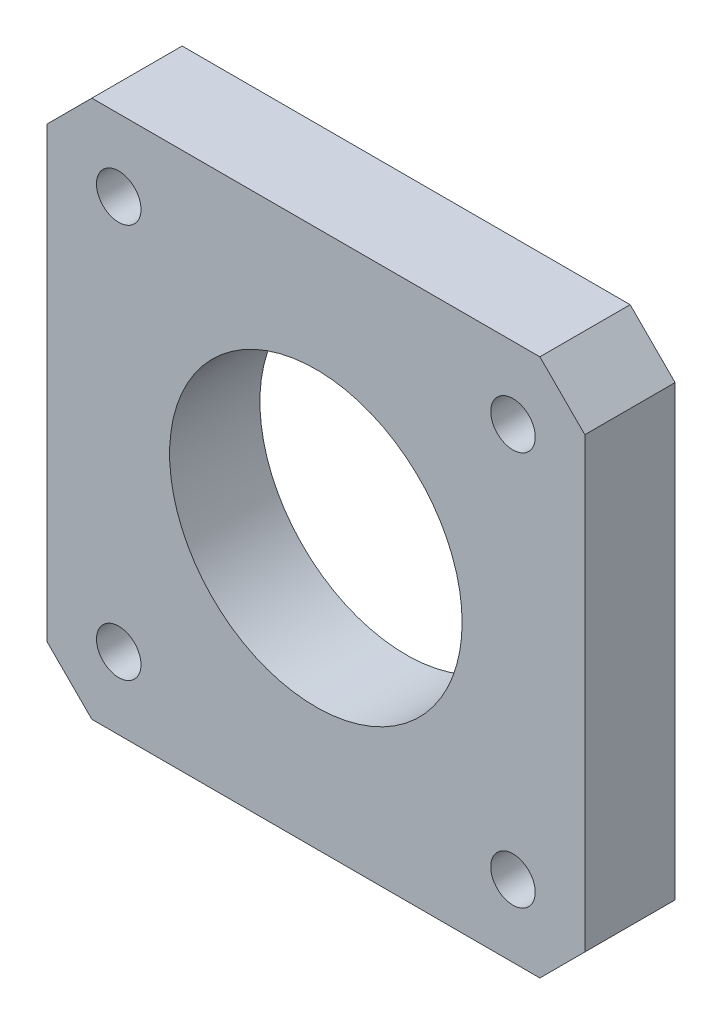
ISO-10303-21;
HEADER;
FILE_DESCRIPTION(('STEP AP214'),'2;1');
FILE_NAME('part.step','',(''),(''),'','','');
FILE_SCHEMA(('AUTOMOTIVE_DESIGN { 1 0 10303 214 1 1 1 1 }'));
ENDSEC;
DATA;
#1=APPLICATION_CONTEXT('core data for automotive mechanical design processes');
#2=APPLICATION_PROTOCOL_DEFINITION('international standard','automotive_design',2000,#1);
#3=PRODUCT_CONTEXT('',#1,'mechanical');
#4=PRODUCT('Part','Part','',(#3));
#5=PRODUCT_RELATED_PRODUCT_CATEGORY('part','',(#4));
#6=PRODUCT_DEFINITION_FORMATION('','',#4);
#7=PRODUCT_DEFINITION_CONTEXT('part definition',#1,'design');
#8=PRODUCT_DEFINITION('design','',#6,#7);
#9=PRODUCT_DEFINITION_SHAPE('','',#8);
#10=(LENGTH_UNIT() NAMED_UNIT(*) SI_UNIT(.MILLI.,.METRE.));
#11=(NAMED_UNIT(*) PLANE_ANGLE_UNIT() SI_UNIT($,.RADIAN.));
#12=(NAMED_UNIT(*) SI_UNIT($,.STERADIAN.) SOLID_ANGLE_UNIT());
#13=UNCERTAINTY_MEASURE_WITH_UNIT(LENGTH_MEASURE(1.E-05),#10,'distance_accuracy_value','');
#14=(GEOMETRIC_REPRESENTATION_CONTEXT(3) GLOBAL_UNCERTAINTY_ASSIGNED_CONTEXT((#13)) GLOBAL_UNIT_ASSIGNED_CONTEXT((#10,
#11,#12)) REPRESENTATION_CONTEXT('',''));
#15=CARTESIAN_POINT('',(0.,0.,0.));
#16=DIRECTION('',(0.,0.,1.));
#17=DIRECTION('',(1.,0.,0.));
#18=AXIS2_PLACEMENT_3D('',#15,#16,#17);
#19=CARTESIAN_POINT('',(0.,0.,3.55));
#20=DIRECTION('',(0.,0.,1.));
#21=DIRECTION('',(1.,0.,0.));
#22=AXIS2_PLACEMENT_3D('',#19,#20,#21);
#23=PLANE('',#22);
#24=CARTESIAN_POINT('',(-15.5,-15.5,3.55));
#25=DIRECTION('',(0.,0.,1.));
#26=DIRECTION('',(1.,0.,0.));
#27=AXIS2_PLACEMENT_3D('',#24,#25,#26);
#28=CIRCLE('',#27,1.75);
#29=CARTESIAN_POINT('',(-13.75,-15.5,3.55));
#30=VERTEX_POINT('',#29);
#31=EDGE_CURVE('E235',#30,#30,#28,.T.);
#32=ORIENTED_EDGE('',*,*,#31,.F.);
#33=EDGE_LOOP('',(#32));
#34=FACE_BOUND('',#33,.T.);
#35=CARTESIAN_POINT('',(15.5,15.5,3.55));
#36=DIRECTION('',(0.,0.,1.));
#37=DIRECTION('',(1.,0.,0.));
#38=AXIS2_PLACEMENT_3D('',#35,#36,#37);
#39=CIRCLE('',#38,1.75);
#40=CARTESIAN_POINT('',(17.25,15.5,3.55));
#41=VERTEX_POINT('',#40);
#42=EDGE_CURVE('E219',#41,#41,#39,.T.);
#43=ORIENTED_EDGE('',*,*,#42,.F.);
#44=EDGE_LOOP('',(#43));
#45=FACE_BOUND('',#44,.T.);
#46=DIRECTION('',(0.707106781186563,0.707106781186532,0.));
#47=VECTOR('',#46,1.);
#48=CARTESIAN_POINT('',(17.6144660940671,-21.1499999999999,3.55));
#49=LINE('',#48,#47);
#50=CARTESIAN_POINT('',(17.6144660940671,-21.1499999999999,3.55));
#51=VERTEX_POINT('',#50);
#52=CARTESIAN_POINT('',(21.15,-17.6144660940672,3.55));
#53=VERTEX_POINT('',#52);
#54=EDGE_CURVE('E170',#51,#53,#49,.T.);
#55=ORIENTED_EDGE('',*,*,#54,.T.);
#56=DIRECTION('',(0.,1.,0.));
#57=VECTOR('',#56,1.);
#58=CARTESIAN_POINT('',(21.15,-17.6144660940672,3.55));
#59=LINE('',#58,#57);
#60=CARTESIAN_POINT('',(21.15,17.6144660940672,3.55));
#61=VERTEX_POINT('',#60);
#62=EDGE_CURVE('E106',#53,#61,#59,.T.);
#63=ORIENTED_EDGE('',*,*,#62,.T.);
#64=DIRECTION('',(-0.707106781186555,0.70710678118654,0.));
#65=VECTOR('',#64,1.);
#66=CARTESIAN_POINT('',(21.15,17.6144660940672,3.55));
#67=LINE('',#66,#65);
#68=CARTESIAN_POINT('',(17.6144660940672,21.1499999999999,3.55));
#69=VERTEX_POINT('',#68);
#70=EDGE_CURVE('E191',#61,#69,#67,.T.);
#71=ORIENTED_EDGE('',*,*,#70,.T.);
#72=DIRECTION('',(-1.,0.,0.));
#73=VECTOR('',#72,1.);
#74=CARTESIAN_POINT('',(17.6144660940672,21.1499999999999,3.55));
#75=LINE('',#74,#73);
#76=CARTESIAN_POINT('',(-17.6144660940672,21.1499999999999,3.55));
#77=VERTEX_POINT('',#76);
#78=EDGE_CURVE('E205',#69,#77,#75,.T.);
#79=ORIENTED_EDGE('',*,*,#78,.T.);
#80=DIRECTION('',(-0.707106781186555,-0.70710678118654,0.));
#81=VECTOR('',#80,1.);
#82=CARTESIAN_POINT('',(-17.6144660940672,21.1499999999999,3.55));
#83=LINE('',#82,#81);
#84=CARTESIAN_POINT('',(-21.15,17.6144660940672,3.55));
#85=VERTEX_POINT('',#84);
#86=EDGE_CURVE('E125',#77,#85,#83,.T.);
#87=ORIENTED_EDGE('',*,*,#86,.T.);
#88=DIRECTION('',(0.,-1.,0.));
#89=VECTOR('',#88,1.);
#90=CARTESIAN_POINT('',(-21.15,17.6144660940672,3.55));
#91=LINE('',#90,#89);
#92=CARTESIAN_POINT('',(-21.15,-17.6144660940672,3.55));
#93=VERTEX_POINT('',#92);
#94=EDGE_CURVE('E119',#85,#93,#91,.T.);
#95=ORIENTED_EDGE('',*,*,#94,.T.);
#96=DIRECTION('',(0.707106781186548,-0.707106781186548,0.));
#97=VECTOR('',#96,1.);
#98=CARTESIAN_POINT('',(-21.15,-17.6144660940672,3.55));
#99=LINE('',#98,#97);
#100=CARTESIAN_POINT('',(-17.6144660940672,-21.1499999999999,3.55));
#101=VERTEX_POINT('',#100);
#102=EDGE_CURVE('E123',#93,#101,#99,.T.);
#103=ORIENTED_EDGE('',*,*,#102,.T.);
#104=DIRECTION('',(1.,0.,0.));
#105=VECTOR('',#104,1.);
#106=CARTESIAN_POINT('',(-17.6144660940672,-21.1499999999999,3.55));
#107=LINE('',#106,#105);
#108=EDGE_CURVE('E63',#101,#51,#107,.T.);
#109=ORIENTED_EDGE('',*,*,#108,.T.);
#110=EDGE_LOOP('',(#55,#63,#71,#79,#87,#95,#103,#109));
#111=FACE_BOUND('',#110,.T.);
#112=CARTESIAN_POINT('',(-15.5,15.5,3.55));
#113=DIRECTION('',(0.,0.,1.));
#114=DIRECTION('',(1.,0.,0.));
#115=AXIS2_PLACEMENT_3D('',#112,#113,#114);
#116=CIRCLE('',#115,1.75);
#117=CARTESIAN_POINT('',(-13.75,15.5,3.55));
#118=VERTEX_POINT('',#117);
#119=EDGE_CURVE('E152',#118,#118,#116,.T.);
#120=ORIENTED_EDGE('',*,*,#119,.F.);
#121=EDGE_LOOP('',(#120));
#122=FACE_BOUND('',#121,.T.);
#123=CARTESIAN_POINT('',(15.5,-15.5,3.55));
#124=DIRECTION('',(0.,0.,1.));
#125=DIRECTION('',(1.,0.,0.));
#126=AXIS2_PLACEMENT_3D('',#123,#124,#125);
#127=CIRCLE('',#126,1.75);
#128=CARTESIAN_POINT('',(17.25,-15.5,3.55));
#129=VERTEX_POINT('',#128);
#130=EDGE_CURVE('E227',#129,#129,#127,.T.);
#131=ORIENTED_EDGE('',*,*,#130,.F.);
#132=EDGE_LOOP('',(#131));
#133=FACE_BOUND('',#132,.T.);
#134=CARTESIAN_POINT('',(0.,0.,3.55));
#135=DIRECTION('',(0.,0.,1.));
#136=DIRECTION('',(1.,0.,0.));
#137=AXIS2_PLACEMENT_3D('',#134,#135,#136);
#138=CIRCLE('',#137,11.5);
#139=CARTESIAN_POINT('',(11.5,0.,3.55));
#140=VERTEX_POINT('',#139);
#141=EDGE_CURVE('E243',#140,#140,#138,.T.);
#142=ORIENTED_EDGE('',*,*,#141,.F.);
#143=EDGE_LOOP('',(#142));
#144=FACE_BOUND('',#143,.T.);
#145=ADVANCED_FACE('F45',(#34,#45,#111,#122,#133,#144),#23,.T.);
#146=CARTESIAN_POINT('',(0.,0.,-3.55));
#147=DIRECTION('',(0.,0.,1.));
#148=DIRECTION('',(1.,0.,0.));
#149=AXIS2_PLACEMENT_3D('',#146,#147,#148);
#150=PLANE('',#149);
#151=DIRECTION('',(0.707106781186563,0.707106781186532,0.));
#152=VECTOR('',#151,1.);
#153=CARTESIAN_POINT('',(17.6144660940671,-21.1499999999999,-3.55));
#154=LINE('',#153,#152);
#155=CARTESIAN_POINT('',(17.6144660940671,-21.1499999999999,-3.55));
#156=VERTEX_POINT('',#155);
#157=CARTESIAN_POINT('',(21.15,-17.6144660940672,-3.55));
#158=VERTEX_POINT('',#157);
#159=EDGE_CURVE('E147',#156,#158,#154,.T.);
#160=ORIENTED_EDGE('',*,*,#159,.F.);
#161=DIRECTION('',(1.,0.,0.));
#162=VECTOR('',#161,1.);
#163=CARTESIAN_POINT('',(-17.6144660940672,-21.1499999999999,-3.55));
#164=LINE('',#163,#162);
#165=CARTESIAN_POINT('',(-17.6144660940672,-21.1499999999999,-3.55));
#166=VERTEX_POINT('',#165);
#167=EDGE_CURVE('E98',#166,#156,#164,.T.);
#168=ORIENTED_EDGE('',*,*,#167,.F.);
#169=DIRECTION('',(0.707106781186548,-0.707106781186548,0.));
#170=VECTOR('',#169,1.);
#171=CARTESIAN_POINT('',(-21.15,-17.6144660940672,-3.55));
#172=LINE('',#171,#170);
#173=CARTESIAN_POINT('',(-21.15,-17.6144660940672,-3.55));
#174=VERTEX_POINT('',#173);
#175=EDGE_CURVE('E92',#174,#166,#172,.T.);
#176=ORIENTED_EDGE('',*,*,#175,.F.);
#177=DIRECTION('',(0.,-1.,0.));
#178=VECTOR('',#177,1.);
#179=CARTESIAN_POINT('',(-21.15,17.6144660940672,-3.55));
#180=LINE('',#179,#178);
#181=CARTESIAN_POINT('',(-21.15,17.6144660940672,-3.55));
#182=VERTEX_POINT('',#181);
#183=EDGE_CURVE('E134',#182,#174,#180,.T.);
#184=ORIENTED_EDGE('',*,*,#183,.F.);
#185=DIRECTION('',(-0.707106781186555,-0.70710678118654,0.));
#186=VECTOR('',#185,1.);
#187=CARTESIAN_POINT('',(-17.6144660940672,21.1499999999999,-3.55));
#188=LINE('',#187,#186);
#189=CARTESIAN_POINT('',(-17.6144660940672,21.1499999999999,-3.55));
#190=VERTEX_POINT('',#189);
#191=EDGE_CURVE('E161',#190,#182,#188,.T.);
#192=ORIENTED_EDGE('',*,*,#191,.F.);
#193=DIRECTION('',(-1.,0.,0.));
#194=VECTOR('',#193,1.);
#195=CARTESIAN_POINT('',(17.6144660940672,21.1499999999999,-3.55));
#196=LINE('',#195,#194);
#197=CARTESIAN_POINT('',(17.6144660940672,21.1499999999999,-3.55));
#198=VERTEX_POINT('',#197);
#199=EDGE_CURVE('E158',#198,#190,#196,.T.);
#200=ORIENTED_EDGE('',*,*,#199,.F.);
#201=DIRECTION('',(-0.707106781186555,0.70710678118654,0.));
#202=VECTOR('',#201,1.);
#203=CARTESIAN_POINT('',(21.15,17.6144660940672,-3.55));
#204=LINE('',#203,#202);
#205=CARTESIAN_POINT('',(21.15,17.6144660940672,-3.55));
#206=VERTEX_POINT('',#205);
#207=EDGE_CURVE('E155',#206,#198,#204,.T.);
#208=ORIENTED_EDGE('',*,*,#207,.F.);
#209=DIRECTION('',(0.,1.,0.));
#210=VECTOR('',#209,1.);
#211=CARTESIAN_POINT('',(21.15,-17.6144660940672,-3.55));
#212=LINE('',#211,#210);
#213=EDGE_CURVE('E151',#158,#206,#212,.T.);
#214=ORIENTED_EDGE('',*,*,#213,.F.);
#215=EDGE_LOOP('',(#160,#168,#176,#184,#192,#200,#208,#214));
#216=FACE_BOUND('',#215,.T.);
#217=CARTESIAN_POINT('',(-15.5,15.5,-3.55));
#218=DIRECTION('',(0.,0.,1.));
#219=DIRECTION('',(1.,0.,0.));
#220=AXIS2_PLACEMENT_3D('',#217,#218,#219);
#221=CIRCLE('',#220,1.75);
#222=CARTESIAN_POINT('',(-13.75,15.5,-3.55));
#223=VERTEX_POINT('',#222);
#224=EDGE_CURVE('E215',#223,#223,#221,.T.);
#225=ORIENTED_EDGE('',*,*,#224,.T.);
#226=EDGE_LOOP('',(#225));
#227=FACE_BOUND('',#226,.T.);
#228=CARTESIAN_POINT('',(15.5,15.5,-3.55));
#229=DIRECTION('',(0.,0.,1.));
#230=DIRECTION('',(1.,0.,0.));
#231=AXIS2_PLACEMENT_3D('',#228,#229,#230);
#232=CIRCLE('',#231,1.75);
#233=CARTESIAN_POINT('',(17.25,15.5,-3.55));
#234=VERTEX_POINT('',#233);
#235=EDGE_CURVE('E223',#234,#234,#232,.T.);
#236=ORIENTED_EDGE('',*,*,#235,.T.);
#237=EDGE_LOOP('',(#236));
#238=FACE_BOUND('',#237,.T.);
#239=CARTESIAN_POINT('',(15.5,-15.5,-3.55));
#240=DIRECTION('',(0.,0.,1.));
#241=DIRECTION('',(1.,0.,0.));
#242=AXIS2_PLACEMENT_3D('',#239,#240,#241);
#243=CIRCLE('',#242,1.75);
#244=CARTESIAN_POINT('',(17.25,-15.5,-3.55));
#245=VERTEX_POINT('',#244);
#246=EDGE_CURVE('E231',#245,#245,#243,.T.);
#247=ORIENTED_EDGE('',*,*,#246,.T.);
#248=EDGE_LOOP('',(#247));
#249=FACE_BOUND('',#248,.T.);
#250=CARTESIAN_POINT('',(-15.5,-15.5,-3.55));
#251=DIRECTION('',(0.,0.,1.));
#252=DIRECTION('',(1.,0.,0.));
#253=AXIS2_PLACEMENT_3D('',#250,#251,#252);
#254=CIRCLE('',#253,1.75);
#255=CARTESIAN_POINT('',(-13.75,-15.5,-3.55));
#256=VERTEX_POINT('',#255);
#257=EDGE_CURVE('E239',#256,#256,#254,.T.);
#258=ORIENTED_EDGE('',*,*,#257,.T.);
#259=EDGE_LOOP('',(#258));
#260=FACE_BOUND('',#259,.T.);
#261=CARTESIAN_POINT('',(0.,0.,-3.55));
#262=DIRECTION('',(0.,0.,1.));
#263=DIRECTION('',(1.,0.,0.));
#264=AXIS2_PLACEMENT_3D('',#261,#262,#263);
#265=CIRCLE('',#264,11.5);
#266=CARTESIAN_POINT('',(11.5,0.,-3.55));
#267=VERTEX_POINT('',#266);
#268=EDGE_CURVE('E247',#267,#267,#265,.T.);
#269=ORIENTED_EDGE('',*,*,#268,.T.);
#270=EDGE_LOOP('',(#269));
#271=FACE_BOUND('',#270,.T.);
#272=ADVANCED_FACE('F195',(#216,#227,#238,#249,#260,#271),#150,.F.);
#273=CARTESIAN_POINT('',(17.6144660940671,-21.1499999999999,3.55));
#274=DIRECTION('',(-0.707106781186532,0.707106781186563,0.));
#275=DIRECTION('',(-0.707106781186563,-0.707106781186532,0.));
#276=AXIS2_PLACEMENT_3D('',#273,#274,#275);
#277=PLANE('',#276);
#278=ORIENTED_EDGE('',*,*,#159,.T.);
#279=DIRECTION('',(0.,0.,-1.));
#280=VECTOR('',#279,1.);
#281=CARTESIAN_POINT('',(21.15,-17.6144660940672,3.55));
#282=LINE('',#281,#280);
#283=EDGE_CURVE('E11',#53,#158,#282,.T.);
#284=ORIENTED_EDGE('',*,*,#283,.F.);
#285=ORIENTED_EDGE('',*,*,#54,.F.);
#286=DIRECTION('',(0.,0.,-1.));
#287=VECTOR('',#286,1.);
#288=CARTESIAN_POINT('',(17.6144660940671,-21.1499999999999,3.55));
#289=LINE('',#288,#287);
#290=EDGE_CURVE('E143',#51,#156,#289,.T.);
#291=ORIENTED_EDGE('',*,*,#290,.T.);
#292=EDGE_LOOP('',(#278,#284,#285,#291));
#293=FACE_BOUND('',#292,.T.);
#294=ADVANCED_FACE('F47',(#293),#277,.F.);
#295=CARTESIAN_POINT('',(21.15,-17.6144660940672,3.55));
#296=DIRECTION('',(-1.,0.,0.));
#297=DIRECTION('',(0.,0.,1.));
#298=AXIS2_PLACEMENT_3D('',#295,#296,#297);
#299=PLANE('',#298);
#300=ORIENTED_EDGE('',*,*,#213,.T.);
#301=DIRECTION('',(0.,0.,-1.));
#302=VECTOR('',#301,1.);
#303=CARTESIAN_POINT('',(21.15,17.6144660940672,3.55));
#304=LINE('',#303,#302);
#305=EDGE_CURVE('E55',#61,#206,#304,.T.);
#306=ORIENTED_EDGE('',*,*,#305,.F.);
#307=ORIENTED_EDGE('',*,*,#62,.F.);
#308=ORIENTED_EDGE('',*,*,#283,.T.);
#309=EDGE_LOOP('',(#300,#306,#307,#308));
#310=FACE_BOUND('',#309,.T.);
#311=ADVANCED_FACE('F283',(#310),#299,.F.);
#312=CARTESIAN_POINT('',(21.15,17.6144660940672,3.55));
#313=DIRECTION('',(-0.70710678118654,-0.707106781186555,0.));
#314=DIRECTION('',(0.707106781186555,-0.70710678118654,0.));
#315=AXIS2_PLACEMENT_3D('',#312,#313,#314);
#316=PLANE('',#315);
#317=ORIENTED_EDGE('',*,*,#207,.T.);
#318=DIRECTION('',(0.,0.,-1.));
#319=VECTOR('',#318,1.);
#320=CARTESIAN_POINT('',(17.6144660940672,21.1499999999999,3.55));
#321=LINE('',#320,#319);
#322=EDGE_CURVE('E181',#69,#198,#321,.T.);
#323=ORIENTED_EDGE('',*,*,#322,.F.);
#324=ORIENTED_EDGE('',*,*,#70,.F.);
#325=ORIENTED_EDGE('',*,*,#305,.T.);
#326=EDGE_LOOP('',(#317,#323,#324,#325));
#327=FACE_BOUND('',#326,.T.);
#328=ADVANCED_FACE('F189',(#327),#316,.F.);
#329=CARTESIAN_POINT('',(17.6144660940672,21.1499999999999,3.55));
#330=DIRECTION('',(0.,-1.,0.));
#331=DIRECTION('',(0.,0.,-1.));
#332=AXIS2_PLACEMENT_3D('',#329,#330,#331);
#333=PLANE('',#332);
#334=ORIENTED_EDGE('',*,*,#199,.T.);
#335=DIRECTION('',(0.,0.,-1.));
#336=VECTOR('',#335,1.);
#337=CARTESIAN_POINT('',(-17.6144660940672,21.1499999999999,3.55));
#338=LINE('',#337,#336);
#339=EDGE_CURVE('E177',#77,#190,#338,.T.);
#340=ORIENTED_EDGE('',*,*,#339,.F.);
#341=ORIENTED_EDGE('',*,*,#78,.F.);
#342=ORIENTED_EDGE('',*,*,#322,.T.);
#343=EDGE_LOOP('',(#334,#340,#341,#342));
#344=FACE_BOUND('',#343,.T.);
#345=ADVANCED_FACE('F200',(#344),#333,.F.);
#346=CARTESIAN_POINT('',(-17.6144660940672,21.1499999999999,3.55));
#347=DIRECTION('',(0.70710678118654,-0.707106781186555,0.));
#348=DIRECTION('',(0.707106781186555,0.70710678118654,0.));
#349=AXIS2_PLACEMENT_3D('',#346,#347,#348);
#350=PLANE('',#349);
#351=ORIENTED_EDGE('',*,*,#191,.T.);
#352=DIRECTION('',(0.,0.,-1.));
#353=VECTOR('',#352,1.);
#354=CARTESIAN_POINT('',(-21.15,17.6144660940672,3.55));
#355=LINE('',#354,#353);
#356=EDGE_CURVE('E136',#85,#182,#355,.T.);
#357=ORIENTED_EDGE('',*,*,#356,.F.);
#358=ORIENTED_EDGE('',*,*,#86,.F.);
#359=ORIENTED_EDGE('',*,*,#339,.T.);
#360=EDGE_LOOP('',(#351,#357,#358,#359));
#361=FACE_BOUND('',#360,.T.);
#362=ADVANCED_FACE('F203',(#361),#350,.F.);
#363=CARTESIAN_POINT('',(-21.15,17.6144660940672,3.55));
#364=DIRECTION('',(1.,0.,0.));
#365=DIRECTION('',(0.,0.,-1.));
#366=AXIS2_PLACEMENT_3D('',#363,#364,#365);
#367=PLANE('',#366);
#368=ORIENTED_EDGE('',*,*,#183,.T.);
#369=DIRECTION('',(0.,0.,-1.));
#370=VECTOR('',#369,1.);
#371=CARTESIAN_POINT('',(-21.15,-17.6144660940672,3.55));
#372=LINE('',#371,#370);
#373=EDGE_CURVE('E131',#93,#174,#372,.T.);
#374=ORIENTED_EDGE('',*,*,#373,.F.);
#375=ORIENTED_EDGE('',*,*,#94,.F.);
#376=ORIENTED_EDGE('',*,*,#356,.T.);
#377=EDGE_LOOP('',(#368,#374,#375,#376));
#378=FACE_BOUND('',#377,.T.);
#379=ADVANCED_FACE('F132',(#378),#367,.F.);
#380=CARTESIAN_POINT('',(-21.15,-17.6144660940672,3.55));
#381=DIRECTION('',(0.707106781186547,0.707106781186547,0.));
#382=DIRECTION('',(-0.707106781186548,0.707106781186548,0.));
#383=AXIS2_PLACEMENT_3D('',#380,#381,#382);
#384=PLANE('',#383);
#385=ORIENTED_EDGE('',*,*,#175,.T.);
#386=DIRECTION('',(0.,0.,-1.));
#387=VECTOR('',#386,1.);
#388=CARTESIAN_POINT('',(-17.6144660940672,-21.1499999999999,3.55));
#389=LINE('',#388,#387);
#390=EDGE_CURVE('E137',#101,#166,#389,.T.);
#391=ORIENTED_EDGE('',*,*,#390,.F.);
#392=ORIENTED_EDGE('',*,*,#102,.F.);
#393=ORIENTED_EDGE('',*,*,#373,.T.);
#394=EDGE_LOOP('',(#385,#391,#392,#393));
#395=FACE_BOUND('',#394,.T.);
#396=ADVANCED_FACE('F139',(#395),#384,.F.);
#397=CARTESIAN_POINT('',(-17.6144660940672,-21.1499999999999,3.55));
#398=DIRECTION('',(0.,1.,0.));
#399=DIRECTION('',(0.,0.,1.));
#400=AXIS2_PLACEMENT_3D('',#397,#398,#399);
#401=PLANE('',#400);
#402=ORIENTED_EDGE('',*,*,#167,.T.);
#403=ORIENTED_EDGE('',*,*,#290,.F.);
#404=ORIENTED_EDGE('',*,*,#108,.F.);
#405=ORIENTED_EDGE('',*,*,#390,.T.);
#406=EDGE_LOOP('',(#402,#403,#404,#405));
#407=FACE_BOUND('',#406,.T.);
#408=ADVANCED_FACE('F271',(#407),#401,.F.);
#409=CARTESIAN_POINT('',(-15.5,15.5,3.55));
#410=DIRECTION('',(0.,0.,-1.));
#411=DIRECTION('',(-1.,0.,0.));
#412=AXIS2_PLACEMENT_3D('',#409,#410,#411);
#413=CYLINDRICAL_SURFACE('',#412,1.75);
#414=ORIENTED_EDGE('',*,*,#119,.T.);
#415=EDGE_LOOP('',(#414));
#416=FACE_BOUND('',#415,.T.);
#417=ORIENTED_EDGE('',*,*,#224,.F.);
#418=EDGE_LOOP('',(#417));
#419=FACE_BOUND('',#418,.T.);
#420=ADVANCED_FACE('F268',(#416,#419),#413,.F.);
#421=CARTESIAN_POINT('',(15.5,15.5,3.55));
#422=DIRECTION('',(0.,0.,-1.));
#423=DIRECTION('',(-1.,0.,0.));
#424=AXIS2_PLACEMENT_3D('',#421,#422,#423);
#425=CYLINDRICAL_SURFACE('',#424,1.75);
#426=ORIENTED_EDGE('',*,*,#42,.T.);
#427=EDGE_LOOP('',(#426));
#428=FACE_BOUND('',#427,.T.);
#429=ORIENTED_EDGE('',*,*,#235,.F.);
#430=EDGE_LOOP('',(#429));
#431=FACE_BOUND('',#430,.T.);
#432=ADVANCED_FACE('F346',(#428,#431),#425,.F.);
#433=CARTESIAN_POINT('',(15.5,-15.5,3.55));
#434=DIRECTION('',(0.,0.,-1.));
#435=DIRECTION('',(-1.,0.,0.));
#436=AXIS2_PLACEMENT_3D('',#433,#434,#435);
#437=CYLINDRICAL_SURFACE('',#436,1.75);
#438=ORIENTED_EDGE('',*,*,#130,.T.);
#439=EDGE_LOOP('',(#438));
#440=FACE_BOUND('',#439,.T.);
#441=ORIENTED_EDGE('',*,*,#246,.F.);
#442=EDGE_LOOP('',(#441));
#443=FACE_BOUND('',#442,.T.);
#444=ADVANCED_FACE('F354',(#440,#443),#437,.F.);
#445=CARTESIAN_POINT('',(-15.5,-15.5,3.55));
#446=DIRECTION('',(0.,0.,-1.));
#447=DIRECTION('',(-1.,0.,0.));
#448=AXIS2_PLACEMENT_3D('',#445,#446,#447);
#449=CYLINDRICAL_SURFACE('',#448,1.75);
#450=ORIENTED_EDGE('',*,*,#31,.T.);
#451=EDGE_LOOP('',(#450));
#452=FACE_BOUND('',#451,.T.);
#453=ORIENTED_EDGE('',*,*,#257,.F.);
#454=EDGE_LOOP('',(#453));
#455=FACE_BOUND('',#454,.T.);
#456=ADVANCED_FACE('F362',(#452,#455),#449,.F.);
#457=CARTESIAN_POINT('',(0.,0.,3.55));
#458=DIRECTION('',(0.,0.,-1.));
#459=DIRECTION('',(-1.,0.,0.));
#460=AXIS2_PLACEMENT_3D('',#457,#458,#459);
#461=CYLINDRICAL_SURFACE('',#460,11.5);
#462=ORIENTED_EDGE('',*,*,#141,.T.);
#463=EDGE_LOOP('',(#462));
#464=FACE_BOUND('',#463,.T.);
#465=ORIENTED_EDGE('',*,*,#268,.F.);
#466=EDGE_LOOP('',(#465));
#467=FACE_BOUND('',#466,.T.);
#468=ADVANCED_FACE('F255',(#464,#467),#461,.F.);
#469=CLOSED_SHELL('',(#145,#272,#294,#311,#328,#345,#362,#379,#396,#408,#420,#432,#444,#456,#468));
#470=MANIFOLD_SOLID_BREP('B2',#469);
#471=ADVANCED_BREP_SHAPE_REPRESENTATION('',(#18,#470),#14);
#472=SHAPE_DEFINITION_REPRESENTATION(#9,#471);
ENDSEC;
END-ISO-10303-21;
